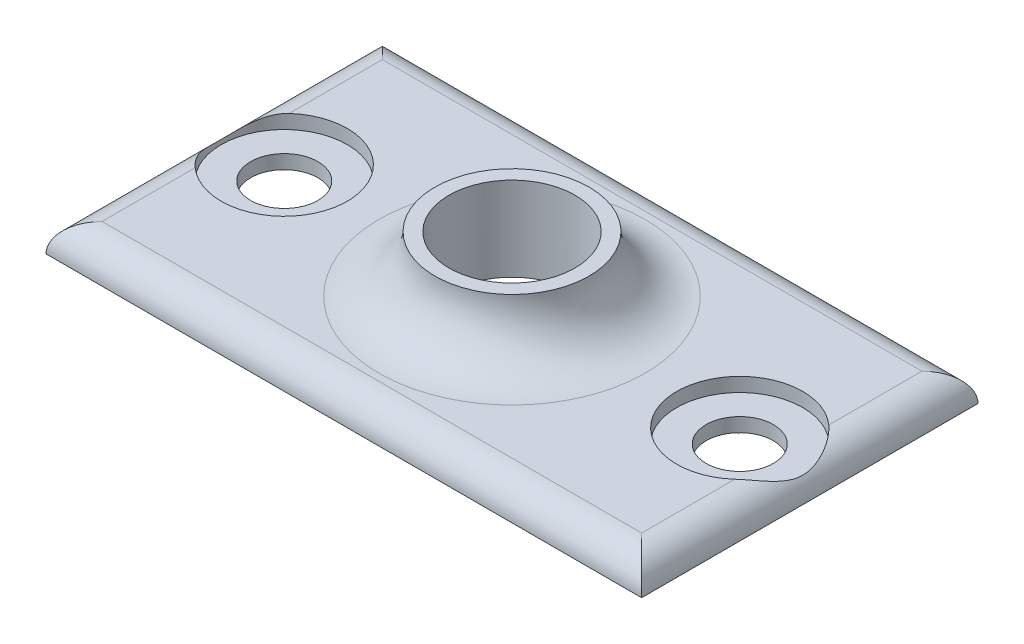
ISO-10303-21;
HEADER;
FILE_DESCRIPTION(('STEP AP214'),'2;1');
FILE_NAME('part.step','',(''),(''),'','','');
FILE_SCHEMA(('AUTOMOTIVE_DESIGN { 1 0 10303 214 1 1 1 1 }'));
ENDSEC;
DATA;
#1=APPLICATION_CONTEXT('core data for automotive mechanical design processes');
#2=APPLICATION_PROTOCOL_DEFINITION('international standard','automotive_design',2000,#1);
#3=PRODUCT_CONTEXT('',#1,'mechanical');
#4=PRODUCT('Part','Part','',(#3));
#5=PRODUCT_RELATED_PRODUCT_CATEGORY('part','',(#4));
#6=PRODUCT_DEFINITION_FORMATION('','',#4);
#7=PRODUCT_DEFINITION_CONTEXT('part definition',#1,'design');
#8=PRODUCT_DEFINITION('design','',#6,#7);
#9=PRODUCT_DEFINITION_SHAPE('','',#8);
#10=(LENGTH_UNIT() NAMED_UNIT(*) SI_UNIT(.MILLI.,.METRE.));
#11=(NAMED_UNIT(*) PLANE_ANGLE_UNIT() SI_UNIT($,.RADIAN.));
#12=(NAMED_UNIT(*) SI_UNIT($,.STERADIAN.) SOLID_ANGLE_UNIT());
#13=UNCERTAINTY_MEASURE_WITH_UNIT(LENGTH_MEASURE(1.E-05),#10,'distance_accuracy_value','');
#14=(GEOMETRIC_REPRESENTATION_CONTEXT(3) GLOBAL_UNCERTAINTY_ASSIGNED_CONTEXT((#13)) GLOBAL_UNIT_ASSIGNED_CONTEXT((#10,
#11,#12)) REPRESENTATION_CONTEXT('',''));
#15=CARTESIAN_POINT('',(0.,0.,0.));
#16=DIRECTION('',(0.,0.,1.));
#17=DIRECTION('',(1.,0.,0.));
#18=AXIS2_PLACEMENT_3D('',#15,#16,#17);
#19=CARTESIAN_POINT('',(0.,2.,0.));
#20=DIRECTION('',(0.,-1.,0.));
#21=DIRECTION('',(0.,0.,-1.));
#22=AXIS2_PLACEMENT_3D('',#19,#20,#21);
#23=PLANE('',#22);
#24=CARTESIAN_POINT('',(0.,2.,0.));
#25=DIRECTION('',(0.,-1.,0.));
#26=DIRECTION('',(0.,0.,-1.));
#27=AXIS2_PLACEMENT_3D('',#24,#25,#26);
#28=CIRCLE('',#27,9.5);
#29=CARTESIAN_POINT('',(0.,2.,-9.5));
#30=VERTEX_POINT('',#29);
#31=EDGE_CURVE('E11',#30,#30,#28,.T.);
#32=ORIENTED_EDGE('',*,*,#31,.T.);
#33=EDGE_LOOP('',(#32));
#34=FACE_BOUND('',#33,.T.);
#35=CARTESIAN_POINT('',(16.25,2.,0.));
#36=DIRECTION('',(0.,1.,0.));
#37=DIRECTION('',(0.,0.,1.));
#38=AXIS2_PLACEMENT_3D('',#35,#36,#37);
#39=CIRCLE('',#38,4.5);
#40=CARTESIAN_POINT('',(19.25,2.,-3.35410196624968));
#41=VERTEX_POINT('',#40);
#42=CARTESIAN_POINT('',(19.25,2.,3.35410196624968));
#43=VERTEX_POINT('',#42);
#44=EDGE_CURVE('E111',#41,#43,#39,.T.);
#45=ORIENTED_EDGE('',*,*,#44,.F.);
#46=DIRECTION('',(0.,0.,-1.));
#47=VECTOR('',#46,1.);
#48=CARTESIAN_POINT('',(19.25,2.,0.));
#49=LINE('',#48,#47);
#50=CARTESIAN_POINT('',(19.25,2.,-10.));
#51=VERTEX_POINT('',#50);
#52=EDGE_CURVE('E54',#41,#51,#49,.T.);
#53=ORIENTED_EDGE('',*,*,#52,.T.);
#54=DIRECTION('',(-1.,0.,0.));
#55=VECTOR('',#54,1.);
#56=CARTESIAN_POINT('',(0.,2.,-10.));
#57=LINE('',#56,#55);
#58=CARTESIAN_POINT('',(-19.25,2.,-10.));
#59=VERTEX_POINT('',#58);
#60=EDGE_CURVE('E58',#51,#59,#57,.T.);
#61=ORIENTED_EDGE('',*,*,#60,.T.);
#62=DIRECTION('',(0.,0.,1.));
#63=VECTOR('',#62,1.);
#64=CARTESIAN_POINT('',(-19.25,2.,0.));
#65=LINE('',#64,#63);
#66=CARTESIAN_POINT('',(-19.25,2.,-3.35410196624969));
#67=VERTEX_POINT('',#66);
#68=EDGE_CURVE('E220',#59,#67,#65,.T.);
#69=ORIENTED_EDGE('',*,*,#68,.T.);
#70=CARTESIAN_POINT('',(-16.25,2.,0.));
#71=DIRECTION('',(0.,1.,0.));
#72=DIRECTION('',(0.,0.,1.));
#73=AXIS2_PLACEMENT_3D('',#70,#71,#72);
#74=CIRCLE('',#73,4.5);
#75=CARTESIAN_POINT('',(-19.25,2.,3.35410196624969));
#76=VERTEX_POINT('',#75);
#77=EDGE_CURVE('E229',#76,#67,#74,.T.);
#78=ORIENTED_EDGE('',*,*,#77,.F.);
#79=DIRECTION('',(0.,0.,1.));
#80=VECTOR('',#79,1.);
#81=CARTESIAN_POINT('',(-19.25,2.,0.));
#82=LINE('',#81,#80);
#83=CARTESIAN_POINT('',(-19.25,2.,10.));
#84=VERTEX_POINT('',#83);
#85=EDGE_CURVE('E215',#76,#84,#82,.T.);
#86=ORIENTED_EDGE('',*,*,#85,.T.);
#87=DIRECTION('',(1.,0.,0.));
#88=VECTOR('',#87,1.);
#89=CARTESIAN_POINT('',(0.,2.,10.));
#90=LINE('',#89,#88);
#91=CARTESIAN_POINT('',(19.25,2.,10.));
#92=VERTEX_POINT('',#91);
#93=EDGE_CURVE('E114',#84,#92,#90,.T.);
#94=ORIENTED_EDGE('',*,*,#93,.T.);
#95=DIRECTION('',(0.,0.,-1.));
#96=VECTOR('',#95,1.);
#97=CARTESIAN_POINT('',(19.25,2.,0.));
#98=LINE('',#97,#96);
#99=EDGE_CURVE('E217',#92,#43,#98,.T.);
#100=ORIENTED_EDGE('',*,*,#99,.T.);
#101=EDGE_LOOP('',(#45,#53,#61,#69,#78,#86,#94,#100));
#102=FACE_BOUND('',#101,.T.);
#103=ADVANCED_FACE('F39',(#34,#102),#23,.F.);
#104=CARTESIAN_POINT('',(0.,0.,0.));
#105=DIRECTION('',(0.,-1.,0.));
#106=DIRECTION('',(0.,0.,-1.));
#107=AXIS2_PLACEMENT_3D('',#104,#105,#106);
#108=PLANE('',#107);
#109=CARTESIAN_POINT('',(16.25,0.,0.));
#110=DIRECTION('',(0.,-1.,0.));
#111=DIRECTION('',(0.,0.,-1.));
#112=AXIS2_PLACEMENT_3D('',#109,#110,#111);
#113=CIRCLE('',#112,2.4);
#114=CARTESIAN_POINT('',(16.25,0.,-2.4));
#115=VERTEX_POINT('',#114);
#116=EDGE_CURVE('E240',#115,#115,#113,.T.);
#117=ORIENTED_EDGE('',*,*,#116,.F.);
#118=EDGE_LOOP('',(#117));
#119=FACE_BOUND('',#118,.T.);
#120=CARTESIAN_POINT('',(-16.25,0.,0.));
#121=DIRECTION('',(0.,-1.,0.));
#122=DIRECTION('',(0.,0.,-1.));
#123=AXIS2_PLACEMENT_3D('',#120,#121,#122);
#124=CIRCLE('',#123,2.4);
#125=CARTESIAN_POINT('',(-16.25,0.,-2.4));
#126=VERTEX_POINT('',#125);
#127=EDGE_CURVE('E236',#126,#126,#124,.T.);
#128=ORIENTED_EDGE('',*,*,#127,.F.);
#129=EDGE_LOOP('',(#128));
#130=FACE_BOUND('',#129,.T.);
#131=CARTESIAN_POINT('',(0.,0.,0.));
#132=DIRECTION('',(0.,1.,0.));
#133=DIRECTION('',(0.,0.,1.));
#134=AXIS2_PLACEMENT_3D('',#131,#132,#133);
#135=CIRCLE('',#134,4.5);
#136=CARTESIAN_POINT('',(0.,0.,4.5));
#137=VERTEX_POINT('',#136);
#138=EDGE_CURVE('E179',#137,#137,#135,.T.);
#139=ORIENTED_EDGE('',*,*,#138,.T.);
#140=EDGE_LOOP('',(#139));
#141=FACE_BOUND('',#140,.T.);
#142=DIRECTION('',(0.,0.,1.));
#143=VECTOR('',#142,1.);
#144=CARTESIAN_POINT('',(-21.25,0.,-12.));
#145=LINE('',#144,#143);
#146=CARTESIAN_POINT('',(-21.25,0.,-12.));
#147=VERTEX_POINT('',#146);
#148=CARTESIAN_POINT('',(-21.25,0.,12.));
#149=VERTEX_POINT('',#148);
#150=EDGE_CURVE('E94',#147,#149,#145,.T.);
#151=ORIENTED_EDGE('',*,*,#150,.F.);
#152=DIRECTION('',(-1.,0.,0.));
#153=VECTOR('',#152,1.);
#154=CARTESIAN_POINT('',(21.25,0.,-12.));
#155=LINE('',#154,#153);
#156=CARTESIAN_POINT('',(21.25,0.,-12.));
#157=VERTEX_POINT('',#156);
#158=EDGE_CURVE('E207',#157,#147,#155,.T.);
#159=ORIENTED_EDGE('',*,*,#158,.F.);
#160=DIRECTION('',(0.,0.,-1.));
#161=VECTOR('',#160,1.);
#162=CARTESIAN_POINT('',(21.25,0.,-12.));
#163=LINE('',#162,#161);
#164=CARTESIAN_POINT('',(21.25,0.,12.));
#165=VERTEX_POINT('',#164);
#166=EDGE_CURVE('E97',#165,#157,#163,.T.);
#167=ORIENTED_EDGE('',*,*,#166,.F.);
#168=DIRECTION('',(1.,0.,0.));
#169=VECTOR('',#168,1.);
#170=CARTESIAN_POINT('',(21.25,0.,12.));
#171=LINE('',#170,#169);
#172=EDGE_CURVE('E91',#149,#165,#171,.T.);
#173=ORIENTED_EDGE('',*,*,#172,.F.);
#174=EDGE_LOOP('',(#151,#159,#167,#173));
#175=FACE_BOUND('',#174,.T.);
#176=ADVANCED_FACE('F93',(#119,#130,#141,#175),#108,.T.);
#177=CARTESIAN_POINT('',(16.25,2.,0.));
#178=DIRECTION('',(0.,-1.,0.));
#179=DIRECTION('',(0.,0.,-1.));
#180=AXIS2_PLACEMENT_3D('',#177,#178,#179);
#181=CYLINDRICAL_SURFACE('',#180,4.5);
#182=CARTESIAN_POINT('',(16.25,1.,0.));
#183=DIRECTION('',(0.,1.,0.));
#184=DIRECTION('',(0.,0.,1.));
#185=AXIS2_PLACEMENT_3D('',#182,#183,#184);
#186=CIRCLE('',#185,4.5);
#187=CARTESIAN_POINT('',(16.25,1.,4.5));
#188=VERTEX_POINT('',#187);
#189=EDGE_CURVE('E205',#188,#188,#186,.T.);
#190=ORIENTED_EDGE('',*,*,#189,.F.);
#191=EDGE_LOOP('',(#190));
#192=FACE_BOUND('',#191,.T.);
#193=ORIENTED_EDGE('',*,*,#44,.T.);
#194=CARTESIAN_POINT('',(19.25,2.,3.35410196624968));
#195=CARTESIAN_POINT('',(19.3134951424224,1.99999312730758,3.29732238949771));
#196=CARTESIAN_POINT('',(19.3753096587503,1.99697896682364,3.23877667267032));
#197=CARTESIAN_POINT('',(19.4952106996756,1.98582339653452,3.1186182689283));
#198=CARTESIAN_POINT('',(19.5533029469115,1.97769007600673,3.05701056176165));
#199=CARTESIAN_POINT('',(19.7208832194283,1.94707845923406,2.868974755076));
#200=CARTESIAN_POINT('',(19.8246503677313,1.91836106537778,2.73845681039851));
#201=CARTESIAN_POINT('',(20.0664345049249,1.83233589073232,2.39764441817079));
#202=CARTESIAN_POINT('',(20.1937086742389,1.76793603699491,2.18153586847288));
#203=CARTESIAN_POINT('',(20.3563946135348,1.66733173886226,1.8447712281878));
#204=CARTESIAN_POINT('',(20.4060238433296,1.63302181656141,1.73005701211145));
#205=CARTESIAN_POINT('',(20.495683526675,1.56569694696453,1.49659965772145));
#206=CARTESIAN_POINT('',(20.5357175405707,1.53268152315463,1.37785803252182));
#207=CARTESIAN_POINT('',(20.6226068073346,1.4562661369126,1.07915602373275));
#208=CARTESIAN_POINT('',(20.6637505144402,1.41532818982446,0.896774222506438));
#209=CARTESIAN_POINT('',(20.7082658701873,1.36891094820627,0.61856835659501));
#210=CARTESIAN_POINT('',(20.7202282637647,1.35595183394247,0.52531969272736));
#211=CARTESIAN_POINT('',(20.7383082074374,1.33608493409378,0.337596465991261));
#212=CARTESIAN_POINT('',(20.7444266052061,1.32917627090132,0.243122082929337));
#213=CARTESIAN_POINT('',(20.7506999313088,1.32209079559082,0.0530182102842169));
#214=CARTESIAN_POINT('',(20.7508105124555,1.32196404481509,-0.0426146583542139));
#215=CARTESIAN_POINT('',(20.7449544298551,1.32858163678203,-0.233452548875625));
#216=CARTESIAN_POINT('',(20.7389874080788,1.33532638432195,-0.328657545220947));
#217=CARTESIAN_POINT('',(20.7210695705836,1.35503839606463,-0.518324870846869));
#218=CARTESIAN_POINT('',(20.7090884828362,1.36803712604157,-0.612780962296138));
#219=CARTESIAN_POINT('',(20.6793420695795,1.3990857392752,-0.799947716838258));
#220=CARTESIAN_POINT('',(20.6615742385939,1.41713780999163,-0.892657605455016));
#221=CARTESIAN_POINT('',(20.6132104760473,1.46395044676167,-1.10840633241642));
#222=CARTESIAN_POINT('',(20.5803002117893,1.49424133596399,-1.23059319914697));
#223=CARTESIAN_POINT('',(20.5046647158099,1.55829143800806,-1.47095768917167));
#224=CARTESIAN_POINT('',(20.4619355375762,1.59205204240708,-1.5891336783965));
#225=CARTESIAN_POINT('',(20.366955776029,1.66006499990883,-1.82108179799185));
#226=CARTESIAN_POINT('',(20.3147288445071,1.69431594099423,-1.93486403513462));
#227=CARTESIAN_POINT('',(20.2007125038589,1.76082460276993,-2.15814219410556));
#228=CARTESIAN_POINT('',(20.1389245859722,1.7930826332011,-2.26763878104092));
#229=CARTESIAN_POINT('',(20.0170284891197,1.84806707839103,-2.46383447794725));
#230=CARTESIAN_POINT('',(19.958400961718,1.87148302867824,-2.55125917549706));
#231=CARTESIAN_POINT('',(19.8346175456251,1.9137650671712,-2.72243791980815));
#232=CARTESIAN_POINT('',(19.7694666285816,1.93263458353091,-2.80619469305825));
#233=CARTESIAN_POINT('',(19.6322236460448,1.96440980427302,-2.97019445530224));
#234=CARTESIAN_POINT('',(19.5600829180463,1.9772694371017,-3.05040616445885));
#235=CARTESIAN_POINT('',(19.4095675925554,1.99506342288046,-3.20608028548293));
#236=CARTESIAN_POINT('',(19.3311768755163,1.99997653814707,-3.28152945428947));
#237=CARTESIAN_POINT('',(19.25,2.00000000000004,-3.35410196624968));
#238=B_SPLINE_CURVE_WITH_KNOTS('',3,(#194,#195,#196,#197,#198,#199,#200,#201,#202,#203,#204,
#205,#206,#207,#208,#209,#210,#211,#212,#213,#214,#215,#216,#217,#218,#219,#220,#221,#222,#223,
#224,#225,#226,#227,#228,#229,#230,#231,#232,#233,#234,#235,#236,#237),.UNSPECIFIED.,.F.,.F.,(4,
2,2,2,2,2,2,2,2,2,2,2,2,2,2,2,2,2,2,2,2,4),(0.,0.25533553399929,0.510268597263102,
1.01624264819143,1.7886853628418,2.17721764196574,2.56560553059363,3.1374658290003,
3.42185925531438,3.70621142401335,3.99266227837148,4.27913000841202,4.56705436529182,
4.85510355037947,5.24488003905779,5.63481346532218,6.02378883518935,6.41270359709704,
6.73589575954196,7.05884345689396,7.38422781565404,7.71048036089903),.UNSPECIFIED.);
#239=EDGE_CURVE('E133',#43,#41,#238,.T.);
#240=ORIENTED_EDGE('',*,*,#239,.T.);
#241=EDGE_LOOP('',(#193,#240));
#242=FACE_BOUND('',#241,.T.);
#243=ADVANCED_FACE('F161',(#192,#242),#181,.F.);
#244=CARTESIAN_POINT('',(0.,2.,0.));
#245=DIRECTION('',(0.,-1.,0.));
#246=DIRECTION('',(0.,0.,-1.));
#247=AXIS2_PLACEMENT_3D('',#244,#245,#246);
#248=CYLINDRICAL_SURFACE('',#247,4.5);
#249=ORIENTED_EDGE('',*,*,#138,.F.);
#250=EDGE_LOOP('',(#249));
#251=FACE_BOUND('',#250,.T.);
#252=CARTESIAN_POINT('',(0.,6.,0.));
#253=DIRECTION('',(0.,-1.,0.));
#254=DIRECTION('',(0.,0.,-1.));
#255=AXIS2_PLACEMENT_3D('',#252,#253,#254);
#256=CIRCLE('',#255,4.5);
#257=CARTESIAN_POINT('',(0.,6.,-4.5));
#258=VERTEX_POINT('',#257);
#259=EDGE_CURVE('E115',#258,#258,#256,.T.);
#260=ORIENTED_EDGE('',*,*,#259,.F.);
#261=EDGE_LOOP('',(#260));
#262=FACE_BOUND('',#261,.T.);
#263=ADVANCED_FACE('F167',(#251,#262),#248,.F.);
#264=CARTESIAN_POINT('',(-16.25,2.,0.));
#265=DIRECTION('',(0.,-1.,0.));
#266=DIRECTION('',(0.,0.,-1.));
#267=AXIS2_PLACEMENT_3D('',#264,#265,#266);
#268=CYLINDRICAL_SURFACE('',#267,4.5);
#269=CARTESIAN_POINT('',(-16.25,1.,0.));
#270=DIRECTION('',(0.,1.,0.));
#271=DIRECTION('',(0.,0.,1.));
#272=AXIS2_PLACEMENT_3D('',#269,#270,#271);
#273=CIRCLE('',#272,4.5);
#274=CARTESIAN_POINT('',(-16.25,1.,4.5));
#275=VERTEX_POINT('',#274);
#276=EDGE_CURVE('E206',#275,#275,#273,.T.);
#277=ORIENTED_EDGE('',*,*,#276,.F.);
#278=EDGE_LOOP('',(#277));
#279=FACE_BOUND('',#278,.T.);
#280=ORIENTED_EDGE('',*,*,#77,.T.);
#281=CARTESIAN_POINT('',(-19.25,2.,-3.35410196624969));
#282=CARTESIAN_POINT('',(-19.3134951424224,1.99999312730758,-3.29732238949772));
#283=CARTESIAN_POINT('',(-19.3753096587503,1.99697896682364,-3.23877667267033));
#284=CARTESIAN_POINT('',(-19.4952106996756,1.98582339653452,-3.11861826892831));
#285=CARTESIAN_POINT('',(-19.5533029469115,1.97769007600673,-3.05701056176166));
#286=CARTESIAN_POINT('',(-19.7208832194283,1.94707845923406,-2.868974755076));
#287=CARTESIAN_POINT('',(-19.8246503677313,1.91836106537778,-2.73845681039852));
#288=CARTESIAN_POINT('',(-20.0664345049249,1.83233589073232,-2.3976444181708));
#289=CARTESIAN_POINT('',(-20.1937086742389,1.76793603699491,-2.18153586847289));
#290=CARTESIAN_POINT('',(-20.3563946135348,1.66733173886226,-1.84477122818782));
#291=CARTESIAN_POINT('',(-20.4060238433296,1.63302181656141,-1.73005701211146));
#292=CARTESIAN_POINT('',(-20.495683526675,1.56569694696452,-1.49659965772146));
#293=CARTESIAN_POINT('',(-20.5357175405707,1.53268152315462,-1.37785803252183));
#294=CARTESIAN_POINT('',(-20.6226068073346,1.45626613691259,-1.07915602373277));
#295=CARTESIAN_POINT('',(-20.6637505144402,1.41532818982445,-0.896774222506453));
#296=CARTESIAN_POINT('',(-20.7082658701873,1.36891094820627,-0.618568356595026));
#297=CARTESIAN_POINT('',(-20.7202282637647,1.35595183394246,-0.525319692727376));
#298=CARTESIAN_POINT('',(-20.7383082074374,1.33608493409377,-0.337596465991277));
#299=CARTESIAN_POINT('',(-20.7444266052061,1.32917627090131,-0.243122082929353));
#300=CARTESIAN_POINT('',(-20.7506999313088,1.32209079559081,-0.0530182102842336));
#301=CARTESIAN_POINT('',(-20.7508105124555,1.32196404481508,0.0426146583541971));
#302=CARTESIAN_POINT('',(-20.7449544298551,1.32858163678202,0.233452548875608));
#303=CARTESIAN_POINT('',(-20.7389874080788,1.33532638432194,0.328657545220931));
#304=CARTESIAN_POINT('',(-20.7210695705836,1.35503839606462,0.518324870846852));
#305=CARTESIAN_POINT('',(-20.7090884828362,1.36803712604156,0.612780962296121));
#306=CARTESIAN_POINT('',(-20.6793420695795,1.39908573927519,0.799947716838241));
#307=CARTESIAN_POINT('',(-20.6615742385939,1.41713780999162,0.892657605455));
#308=CARTESIAN_POINT('',(-20.6132104760474,1.46395044676166,1.1084063324164));
#309=CARTESIAN_POINT('',(-20.5803002117893,1.49424133596397,1.23059319914696));
#310=CARTESIAN_POINT('',(-20.5046647158099,1.55829143800805,1.47095768917165));
#311=CARTESIAN_POINT('',(-20.4619355375762,1.59205204240707,1.58913367839648));
#312=CARTESIAN_POINT('',(-20.366955776029,1.66006499990881,1.82108179799183));
#313=CARTESIAN_POINT('',(-20.3147288445071,1.69431594099422,1.9348640351346));
#314=CARTESIAN_POINT('',(-20.2007125038589,1.76082460276992,2.15814219410554));
#315=CARTESIAN_POINT('',(-20.1389245859722,1.79308263320109,2.2676387810409));
#316=CARTESIAN_POINT('',(-20.0170284891197,1.84806707839103,2.46383447794723));
#317=CARTESIAN_POINT('',(-19.958400961718,1.87148302867824,2.55125917549705));
#318=CARTESIAN_POINT('',(-19.8346175456251,1.9137650671712,2.72243791980814));
#319=CARTESIAN_POINT('',(-19.7694666285816,1.9326345835309,2.80619469305825));
#320=CARTESIAN_POINT('',(-19.6322236460448,1.96440980427302,2.97019445530224));
#321=CARTESIAN_POINT('',(-19.5600829180463,1.9772694371017,3.05040616445885));
#322=CARTESIAN_POINT('',(-19.4095675925554,1.99506342288046,3.20608028548293));
#323=CARTESIAN_POINT('',(-19.3311768755163,1.99997653814707,3.28152945428948));
#324=CARTESIAN_POINT('',(-19.25,2.00000000000004,3.35410196624968));
#325=B_SPLINE_CURVE_WITH_KNOTS('',3,(#281,#282,#283,#284,#285,#286,#287,#288,#289,#290,#291,
#292,#293,#294,#295,#296,#297,#298,#299,#300,#301,#302,#303,#304,#305,#306,#307,#308,#309,#310,
#311,#312,#313,#314,#315,#316,#317,#318,#319,#320,#321,#322,#323,#324),.UNSPECIFIED.,.F.,.F.,(4,
2,2,2,2,2,2,2,2,2,2,2,2,2,2,2,2,2,2,2,2,4),(0.,0.25533553399929,0.510268597263101,
1.01624264819143,1.78868536284179,2.17721764196574,2.56560553059362,3.1374658290003,
3.42185925531437,3.70621142401335,3.99266227837148,4.27913000841202,4.56705436529181,
4.85510355037946,5.24488003905778,5.63481346532217,6.02378883518934,6.41270359709702,
6.73589575954195,7.05884345689397,7.38422781565406,7.71048036089905),.UNSPECIFIED.);
#326=EDGE_CURVE('E47',#67,#76,#325,.T.);
#327=ORIENTED_EDGE('',*,*,#326,.T.);
#328=EDGE_LOOP('',(#280,#327));
#329=FACE_BOUND('',#328,.T.);
#330=ADVANCED_FACE('F141',(#279,#329),#268,.F.);
#331=CARTESIAN_POINT('',(0.,1.,0.));
#332=DIRECTION('',(0.,1.,0.));
#333=DIRECTION('',(0.,0.,1.));
#334=AXIS2_PLACEMENT_3D('',#331,#332,#333);
#335=PLANE('',#334);
#336=CARTESIAN_POINT('',(16.25,1.,0.));
#337=DIRECTION('',(0.,1.,0.));
#338=DIRECTION('',(0.,0.,1.));
#339=AXIS2_PLACEMENT_3D('',#336,#337,#338);
#340=CIRCLE('',#339,2.4);
#341=CARTESIAN_POINT('',(16.25,1.,2.4));
#342=VERTEX_POINT('',#341);
#343=EDGE_CURVE('E202',#342,#342,#340,.T.);
#344=ORIENTED_EDGE('',*,*,#343,.F.);
#345=EDGE_LOOP('',(#344));
#346=FACE_BOUND('',#345,.T.);
#347=ORIENTED_EDGE('',*,*,#189,.T.);
#348=EDGE_LOOP('',(#347));
#349=FACE_BOUND('',#348,.T.);
#350=ADVANCED_FACE('F174',(#346,#349),#335,.T.);
#351=CARTESIAN_POINT('',(0.,1.,0.));
#352=DIRECTION('',(0.,1.,0.));
#353=DIRECTION('',(0.,0.,1.));
#354=AXIS2_PLACEMENT_3D('',#351,#352,#353);
#355=PLANE('',#354);
#356=CARTESIAN_POINT('',(-16.25,1.,0.));
#357=DIRECTION('',(0.,1.,0.));
#358=DIRECTION('',(0.,0.,1.));
#359=AXIS2_PLACEMENT_3D('',#356,#357,#358);
#360=CIRCLE('',#359,2.4);
#361=CARTESIAN_POINT('',(-16.25,1.,2.4));
#362=VERTEX_POINT('',#361);
#363=EDGE_CURVE('E126',#362,#362,#360,.T.);
#364=ORIENTED_EDGE('',*,*,#363,.F.);
#365=EDGE_LOOP('',(#364));
#366=FACE_BOUND('',#365,.T.);
#367=ORIENTED_EDGE('',*,*,#276,.T.);
#368=EDGE_LOOP('',(#367));
#369=FACE_BOUND('',#368,.T.);
#370=ADVANCED_FACE('F183',(#366,#369),#355,.T.);
#371=CARTESIAN_POINT('',(-5.5,6.,0.));
#372=DIRECTION('',(0.,-1.,0.));
#373=DIRECTION('',(0.,0.,-1.));
#374=AXIS2_PLACEMENT_3D('',#371,#372,#373);
#375=PLANE('',#374);
#376=CARTESIAN_POINT('',(0.,6.,0.));
#377=DIRECTION('',(0.,-1.,0.));
#378=DIRECTION('',(0.,0.,-1.));
#379=AXIS2_PLACEMENT_3D('',#376,#377,#378);
#380=CIRCLE('',#379,5.5);
#381=CARTESIAN_POINT('',(0.,6.,-5.5));
#382=VERTEX_POINT('',#381);
#383=EDGE_CURVE('E117',#382,#382,#380,.T.);
#384=ORIENTED_EDGE('',*,*,#383,.F.);
#385=EDGE_LOOP('',(#384));
#386=FACE_BOUND('',#385,.T.);
#387=ORIENTED_EDGE('',*,*,#259,.T.);
#388=EDGE_LOOP('',(#387));
#389=FACE_BOUND('',#388,.T.);
#390=ADVANCED_FACE('F148',(#386,#389),#375,.F.);
#391=CARTESIAN_POINT('',(-19.25,0.,0.));
#392=DIRECTION('',(0.,0.,1.));
#393=DIRECTION('',(1.,0.,0.));
#394=AXIS2_PLACEMENT_3D('',#391,#392,#393);
#395=CYLINDRICAL_SURFACE('',#394,2.);
#396=CARTESIAN_POINT('',(-19.25,0.,-10.));
#397=DIRECTION('',(-0.707106781186547,0.,0.707106781186548));
#398=DIRECTION('',(0.707106781186548,0.,0.707106781186547));
#399=AXIS2_PLACEMENT_3D('',#396,#397,#398);
#400=ELLIPSE('',#399,2.82842712474619,2.);
#401=EDGE_CURVE('E109',#147,#59,#400,.F.);
#402=ORIENTED_EDGE('',*,*,#401,.F.);
#403=ORIENTED_EDGE('',*,*,#150,.T.);
#404=CARTESIAN_POINT('',(-19.25,0.,10.));
#405=DIRECTION('',(0.707106781186548,0.,0.707106781186547));
#406=DIRECTION('',(0.707106781186547,0.,-0.707106781186548));
#407=AXIS2_PLACEMENT_3D('',#404,#405,#406);
#408=ELLIPSE('',#407,2.82842712474619,2.);
#409=EDGE_CURVE('E106',#84,#149,#408,.T.);
#410=ORIENTED_EDGE('',*,*,#409,.F.);
#411=ORIENTED_EDGE('',*,*,#85,.F.);
#412=ORIENTED_EDGE('',*,*,#326,.F.);
#413=ORIENTED_EDGE('',*,*,#68,.F.);
#414=EDGE_LOOP('',(#402,#403,#410,#411,#412,#413));
#415=FACE_BOUND('',#414,.T.);
#416=ADVANCED_FACE('F104',(#415),#395,.T.);
#417=CARTESIAN_POINT('',(0.,0.,10.));
#418=DIRECTION('',(1.,0.,0.));
#419=DIRECTION('',(0.,0.,-1.));
#420=AXIS2_PLACEMENT_3D('',#417,#418,#419);
#421=CYLINDRICAL_SURFACE('',#420,2.);
#422=ORIENTED_EDGE('',*,*,#409,.T.);
#423=ORIENTED_EDGE('',*,*,#172,.T.);
#424=CARTESIAN_POINT('',(19.25,0.,10.));
#425=DIRECTION('',(0.707106781186547,0.,-0.707106781186548));
#426=DIRECTION('',(0.707106781186548,0.,0.707106781186547));
#427=AXIS2_PLACEMENT_3D('',#424,#425,#426);
#428=ELLIPSE('',#427,2.82842712474619,2.);
#429=EDGE_CURVE('E119',#92,#165,#428,.T.);
#430=ORIENTED_EDGE('',*,*,#429,.F.);
#431=ORIENTED_EDGE('',*,*,#93,.F.);
#432=EDGE_LOOP('',(#422,#423,#430,#431));
#433=FACE_BOUND('',#432,.T.);
#434=ADVANCED_FACE('F113',(#433),#421,.T.);
#435=CARTESIAN_POINT('',(0.,0.,-10.));
#436=DIRECTION('',(-1.,0.,0.));
#437=DIRECTION('',(0.,0.,1.));
#438=AXIS2_PLACEMENT_3D('',#435,#436,#437);
#439=CYLINDRICAL_SURFACE('',#438,2.);
#440=ORIENTED_EDGE('',*,*,#401,.T.);
#441=ORIENTED_EDGE('',*,*,#60,.F.);
#442=CARTESIAN_POINT('',(19.25,0.,-10.));
#443=DIRECTION('',(-0.707106781186548,0.,-0.707106781186547));
#444=DIRECTION('',(-0.707106781186547,0.,0.707106781186548));
#445=AXIS2_PLACEMENT_3D('',#442,#443,#444);
#446=ELLIPSE('',#445,2.82842712474619,2.);
#447=EDGE_CURVE('E123',#157,#51,#446,.F.);
#448=ORIENTED_EDGE('',*,*,#447,.F.);
#449=ORIENTED_EDGE('',*,*,#158,.T.);
#450=EDGE_LOOP('',(#440,#441,#448,#449));
#451=FACE_BOUND('',#450,.T.);
#452=ADVANCED_FACE('F151',(#451),#439,.T.);
#453=CARTESIAN_POINT('',(19.25,0.,0.));
#454=DIRECTION('',(0.,0.,-1.));
#455=DIRECTION('',(-1.,0.,0.));
#456=AXIS2_PLACEMENT_3D('',#453,#454,#455);
#457=CYLINDRICAL_SURFACE('',#456,2.);
#458=ORIENTED_EDGE('',*,*,#429,.T.);
#459=ORIENTED_EDGE('',*,*,#166,.T.);
#460=ORIENTED_EDGE('',*,*,#447,.T.);
#461=ORIENTED_EDGE('',*,*,#52,.F.);
#462=ORIENTED_EDGE('',*,*,#239,.F.);
#463=ORIENTED_EDGE('',*,*,#99,.F.);
#464=EDGE_LOOP('',(#458,#459,#460,#461,#462,#463));
#465=FACE_BOUND('',#464,.T.);
#466=ADVANCED_FACE('F153',(#465),#457,.T.);
#467=CARTESIAN_POINT('',(0.,6.,0.));
#468=DIRECTION('',(0.,-1.,0.));
#469=DIRECTION('',(0.,0.,-1.));
#470=AXIS2_PLACEMENT_3D('',#467,#468,#469);
#471=TOROIDAL_SURFACE('',#470,9.5,4.);
#472=ORIENTED_EDGE('',*,*,#31,.F.);
#473=EDGE_LOOP('',(#472));
#474=FACE_BOUND('',#473,.T.);
#475=ORIENTED_EDGE('',*,*,#383,.T.);
#476=EDGE_LOOP('',(#475));
#477=FACE_BOUND('',#476,.T.);
#478=ADVANCED_FACE('F41',(#474,#477),#471,.F.);
#479=CARTESIAN_POINT('',(-16.25,0.,0.));
#480=DIRECTION('',(0.,-1.,0.));
#481=DIRECTION('',(0.,0.,-1.));
#482=AXIS2_PLACEMENT_3D('',#479,#480,#481);
#483=CYLINDRICAL_SURFACE('',#482,2.4);
#484=ORIENTED_EDGE('',*,*,#363,.T.);
#485=EDGE_LOOP('',(#484));
#486=FACE_BOUND('',#485,.T.);
#487=ORIENTED_EDGE('',*,*,#127,.T.);
#488=EDGE_LOOP('',(#487));
#489=FACE_BOUND('',#488,.T.);
#490=ADVANCED_FACE('F193',(#486,#489),#483,.F.);
#491=CARTESIAN_POINT('',(16.25,0.,0.));
#492=DIRECTION('',(0.,-1.,0.));
#493=DIRECTION('',(0.,0.,-1.));
#494=AXIS2_PLACEMENT_3D('',#491,#492,#493);
#495=CYLINDRICAL_SURFACE('',#494,2.4);
#496=ORIENTED_EDGE('',*,*,#343,.T.);
#497=EDGE_LOOP('',(#496));
#498=FACE_BOUND('',#497,.T.);
#499=ORIENTED_EDGE('',*,*,#116,.T.);
#500=EDGE_LOOP('',(#499));
#501=FACE_BOUND('',#500,.T.);
#502=ADVANCED_FACE('F244',(#498,#501),#495,.F.);
#503=CLOSED_SHELL('',(#103,#176,#243,#263,#330,#350,#370,#390,#416,#434,#452,#466,#478,#490,#502));
#504=MANIFOLD_SOLID_BREP('B2',#503);
#505=ADVANCED_BREP_SHAPE_REPRESENTATION('',(#18,#504),#14);
#506=SHAPE_DEFINITION_REPRESENTATION(#9,#505);
ENDSEC;
END-ISO-10303-21;
